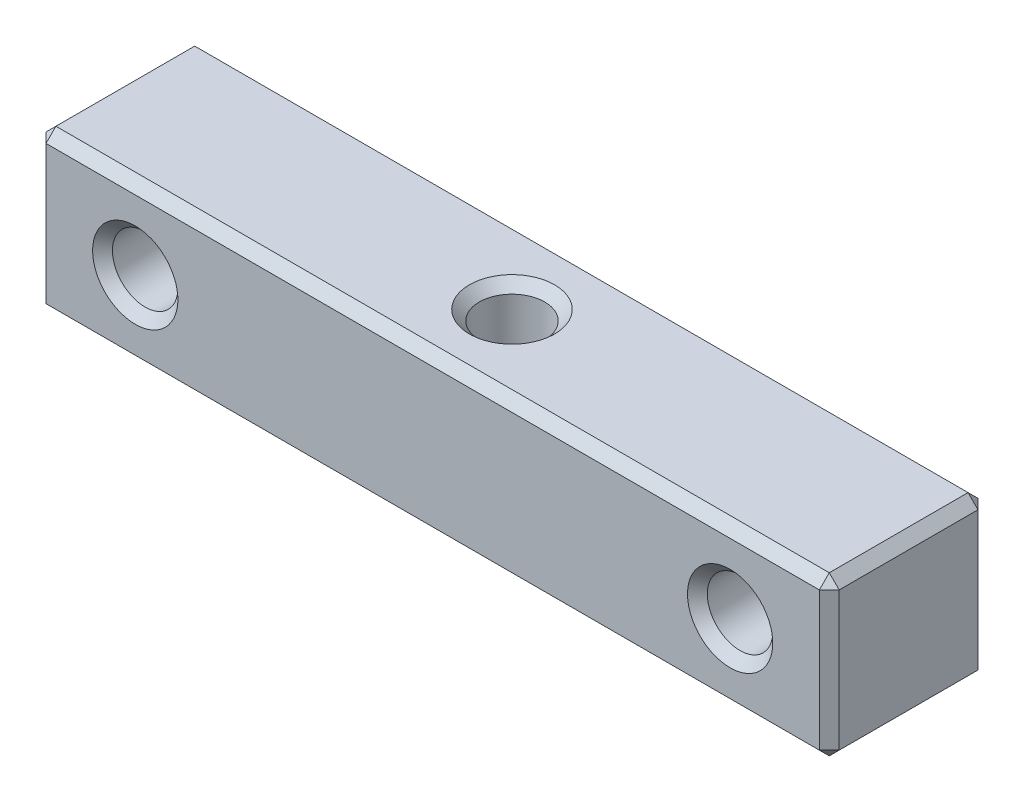
ISO-10303-21;
HEADER;
FILE_DESCRIPTION(('STEP AP214'),'2;1');
FILE_NAME('part.step','',(''),(''),'','','');
FILE_SCHEMA(('AUTOMOTIVE_DESIGN { 1 0 10303 214 1 1 1 1 }'));
ENDSEC;
DATA;
#1=APPLICATION_CONTEXT('core data for automotive mechanical design processes');
#2=APPLICATION_PROTOCOL_DEFINITION('international standard','automotive_design',2000,#1);
#3=PRODUCT_CONTEXT('',#1,'mechanical');
#4=PRODUCT('Part','Part','',(#3));
#5=PRODUCT_RELATED_PRODUCT_CATEGORY('part','',(#4));
#6=PRODUCT_DEFINITION_FORMATION('','',#4);
#7=PRODUCT_DEFINITION_CONTEXT('part definition',#1,'design');
#8=PRODUCT_DEFINITION('design','',#6,#7);
#9=PRODUCT_DEFINITION_SHAPE('','',#8);
#10=(LENGTH_UNIT() NAMED_UNIT(*) SI_UNIT(.MILLI.,.METRE.));
#11=(NAMED_UNIT(*) PLANE_ANGLE_UNIT() SI_UNIT($,.RADIAN.));
#12=(NAMED_UNIT(*) SI_UNIT($,.STERADIAN.) SOLID_ANGLE_UNIT());
#13=UNCERTAINTY_MEASURE_WITH_UNIT(LENGTH_MEASURE(1.E-05),#10,'distance_accuracy_value','');
#14=(GEOMETRIC_REPRESENTATION_CONTEXT(3) GLOBAL_UNCERTAINTY_ASSIGNED_CONTEXT((#13)) GLOBAL_UNIT_ASSIGNED_CONTEXT((#10,
#11,#12)) REPRESENTATION_CONTEXT('',''));
#15=CARTESIAN_POINT('',(0.,0.,0.));
#16=DIRECTION('',(0.,0.,1.));
#17=DIRECTION('',(1.,0.,0.));
#18=AXIS2_PLACEMENT_3D('',#15,#16,#17);
#19=CARTESIAN_POINT('',(20.,-4.,4.));
#20=DIRECTION('',(-1.,0.,0.));
#21=DIRECTION('',(0.,0.,1.));
#22=AXIS2_PLACEMENT_3D('',#19,#20,#21);
#23=PLANE('',#22);
#24=DIRECTION('',(0.,1.,0.));
#25=VECTOR('',#24,1.);
#26=CARTESIAN_POINT('',(20.,4.,-3.5));
#27=LINE('',#26,#25);
#28=CARTESIAN_POINT('',(20.,-3.50000000000001,-3.5));
#29=VERTEX_POINT('',#28);
#30=CARTESIAN_POINT('',(20.,3.5,-3.5));
#31=VERTEX_POINT('',#30);
#32=EDGE_CURVE('E205',#29,#31,#27,.T.);
#33=ORIENTED_EDGE('',*,*,#32,.T.);
#34=DIRECTION('',(0.,0.,1.));
#35=VECTOR('',#34,1.);
#36=CARTESIAN_POINT('',(20.,3.5,4.));
#37=LINE('',#36,#35);
#38=CARTESIAN_POINT('',(20.,3.5,3.5));
#39=VERTEX_POINT('',#38);
#40=EDGE_CURVE('E214',#31,#39,#37,.T.);
#41=ORIENTED_EDGE('',*,*,#40,.T.);
#42=DIRECTION('',(0.,-1.,0.));
#43=VECTOR('',#42,1.);
#44=CARTESIAN_POINT('',(20.,-4.,3.5));
#45=LINE('',#44,#43);
#46=CARTESIAN_POINT('',(20.,-3.50000000000001,3.5));
#47=VERTEX_POINT('',#46);
#48=EDGE_CURVE('E211',#39,#47,#45,.T.);
#49=ORIENTED_EDGE('',*,*,#48,.T.);
#50=DIRECTION('',(0.,0.,-1.));
#51=VECTOR('',#50,1.);
#52=CARTESIAN_POINT('',(20.,-3.50000000000001,4.));
#53=LINE('',#52,#51);
#54=EDGE_CURVE('E208',#47,#29,#53,.T.);
#55=ORIENTED_EDGE('',*,*,#54,.T.);
#56=EDGE_LOOP('',(#33,#41,#49,#55));
#57=FACE_BOUND('',#56,.T.);
#58=ADVANCED_FACE('F42',(#57),#23,.F.);
#59=CARTESIAN_POINT('',(-20.,4.,4.));
#60=DIRECTION('',(0.,-1.,0.));
#61=DIRECTION('',(0.,0.,-1.));
#62=AXIS2_PLACEMENT_3D('',#59,#60,#61);
#63=PLANE('',#62);
#64=DIRECTION('',(0.,0.,1.));
#65=VECTOR('',#64,1.);
#66=CARTESIAN_POINT('',(-19.5,4.,4.));
#67=LINE('',#66,#65);
#68=CARTESIAN_POINT('',(-19.5,4.,-3.5));
#69=VERTEX_POINT('',#68);
#70=CARTESIAN_POINT('',(-19.5,4.,3.5));
#71=VERTEX_POINT('',#70);
#72=EDGE_CURVE('E195',#69,#71,#67,.T.);
#73=ORIENTED_EDGE('',*,*,#72,.T.);
#74=DIRECTION('',(1.,0.,0.));
#75=VECTOR('',#74,1.);
#76=CARTESIAN_POINT('',(-20.,4.,3.5));
#77=LINE('',#76,#75);
#78=CARTESIAN_POINT('',(19.5,4.,3.5));
#79=VERTEX_POINT('',#78);
#80=EDGE_CURVE('E201',#71,#79,#77,.T.);
#81=ORIENTED_EDGE('',*,*,#80,.T.);
#82=DIRECTION('',(0.,0.,-1.));
#83=VECTOR('',#82,1.);
#84=CARTESIAN_POINT('',(19.5,4.,4.));
#85=LINE('',#84,#83);
#86=CARTESIAN_POINT('',(19.5,4.,-3.5));
#87=VERTEX_POINT('',#86);
#88=EDGE_CURVE('E198',#79,#87,#85,.T.);
#89=ORIENTED_EDGE('',*,*,#88,.T.);
#90=DIRECTION('',(-1.,0.,0.));
#91=VECTOR('',#90,1.);
#92=CARTESIAN_POINT('',(-20.,4.,-3.5));
#93=LINE('',#92,#91);
#94=EDGE_CURVE('E192',#87,#69,#93,.T.);
#95=ORIENTED_EDGE('',*,*,#94,.T.);
#96=EDGE_LOOP('',(#73,#81,#89,#95));
#97=FACE_BOUND('',#96,.T.);
#98=CARTESIAN_POINT('',(0.,4.,0.));
#99=DIRECTION('',(0.,-1.,0.));
#100=DIRECTION('',(0.,0.,-1.));
#101=AXIS2_PLACEMENT_3D('',#98,#99,#100);
#102=CIRCLE('',#101,2.14999999999999);
#103=CARTESIAN_POINT('',(0.,4.,-2.14999999999999));
#104=VERTEX_POINT('',#103);
#105=EDGE_CURVE('E188',#104,#104,#102,.T.);
#106=ORIENTED_EDGE('',*,*,#105,.T.);
#107=EDGE_LOOP('',(#106));
#108=FACE_BOUND('',#107,.T.);
#109=ADVANCED_FACE('F394',(#97,#108),#63,.F.);
#110=CARTESIAN_POINT('',(-20.,-4.,4.));
#111=DIRECTION('',(1.,0.,0.));
#112=DIRECTION('',(0.,0.,-1.));
#113=AXIS2_PLACEMENT_3D('',#110,#111,#112);
#114=PLANE('',#113);
#115=DIRECTION('',(0.,0.,1.));
#116=VECTOR('',#115,1.);
#117=CARTESIAN_POINT('',(-20.,-3.5,4.));
#118=LINE('',#117,#116);
#119=CARTESIAN_POINT('',(-20.,-3.5,-3.5));
#120=VERTEX_POINT('',#119);
#121=CARTESIAN_POINT('',(-20.,-3.5,3.5));
#122=VERTEX_POINT('',#121);
#123=EDGE_CURVE('E221',#120,#122,#118,.T.);
#124=ORIENTED_EDGE('',*,*,#123,.T.);
#125=DIRECTION('',(0.,1.,0.));
#126=VECTOR('',#125,1.);
#127=CARTESIAN_POINT('',(-20.,-4.,3.5));
#128=LINE('',#127,#126);
#129=CARTESIAN_POINT('',(-20.,3.5,3.5));
#130=VERTEX_POINT('',#129);
#131=EDGE_CURVE('E228',#122,#130,#128,.T.);
#132=ORIENTED_EDGE('',*,*,#131,.T.);
#133=DIRECTION('',(0.,0.,-1.));
#134=VECTOR('',#133,1.);
#135=CARTESIAN_POINT('',(-20.,3.5,4.));
#136=LINE('',#135,#134);
#137=CARTESIAN_POINT('',(-20.,3.5,-3.5));
#138=VERTEX_POINT('',#137);
#139=EDGE_CURVE('E224',#130,#138,#136,.T.);
#140=ORIENTED_EDGE('',*,*,#139,.T.);
#141=DIRECTION('',(0.,-1.,0.));
#142=VECTOR('',#141,1.);
#143=CARTESIAN_POINT('',(-20.,-4.,-3.5));
#144=LINE('',#143,#142);
#145=EDGE_CURVE('E218',#138,#120,#144,.T.);
#146=ORIENTED_EDGE('',*,*,#145,.T.);
#147=EDGE_LOOP('',(#124,#132,#140,#146));
#148=FACE_BOUND('',#147,.T.);
#149=ADVANCED_FACE('F400',(#148),#114,.F.);
#150=CARTESIAN_POINT('',(-20.,-4.,4.));
#151=DIRECTION('',(0.,1.,0.));
#152=DIRECTION('',(0.,0.,1.));
#153=AXIS2_PLACEMENT_3D('',#150,#151,#152);
#154=PLANE('',#153);
#155=DIRECTION('',(-1.,0.,0.));
#156=VECTOR('',#155,1.);
#157=CARTESIAN_POINT('',(-20.,-4.,3.5));
#158=LINE('',#157,#156);
#159=CARTESIAN_POINT('',(19.5,-4.,3.5));
#160=VERTEX_POINT('',#159);
#161=CARTESIAN_POINT('',(-19.5,-4.,3.5));
#162=VERTEX_POINT('',#161);
#163=EDGE_CURVE('E154',#160,#162,#158,.T.);
#164=ORIENTED_EDGE('',*,*,#163,.T.);
#165=DIRECTION('',(0.,0.,-1.));
#166=VECTOR('',#165,1.);
#167=CARTESIAN_POINT('',(-19.5,-4.,4.));
#168=LINE('',#167,#166);
#169=CARTESIAN_POINT('',(-19.5,-4.,-3.5));
#170=VERTEX_POINT('',#169);
#171=EDGE_CURVE('E243',#162,#170,#168,.T.);
#172=ORIENTED_EDGE('',*,*,#171,.T.);
#173=DIRECTION('',(1.,0.,0.));
#174=VECTOR('',#173,1.);
#175=CARTESIAN_POINT('',(20.,-4.,-3.5));
#176=LINE('',#175,#174);
#177=CARTESIAN_POINT('',(19.5,-4.,-3.5));
#178=VERTEX_POINT('',#177);
#179=EDGE_CURVE('E235',#170,#178,#176,.T.);
#180=ORIENTED_EDGE('',*,*,#179,.T.);
#181=DIRECTION('',(0.,0.,1.));
#182=VECTOR('',#181,1.);
#183=CARTESIAN_POINT('',(19.5,-4.,4.));
#184=LINE('',#183,#182);
#185=EDGE_CURVE('E238',#178,#160,#184,.T.);
#186=ORIENTED_EDGE('',*,*,#185,.T.);
#187=EDGE_LOOP('',(#164,#172,#180,#186));
#188=FACE_BOUND('',#187,.T.);
#189=CARTESIAN_POINT('',(0.,-4.,0.));
#190=DIRECTION('',(0.,1.,0.));
#191=DIRECTION('',(0.,0.,1.));
#192=AXIS2_PLACEMENT_3D('',#189,#190,#191);
#193=CIRCLE('',#192,2.14999999999999);
#194=CARTESIAN_POINT('',(0.,-4.,2.14999999999999));
#195=VERTEX_POINT('',#194);
#196=EDGE_CURVE('E231',#195,#195,#193,.T.);
#197=ORIENTED_EDGE('',*,*,#196,.T.);
#198=EDGE_LOOP('',(#197));
#199=FACE_BOUND('',#198,.T.);
#200=ADVANCED_FACE('F570',(#188,#199),#154,.F.);
#201=CARTESIAN_POINT('',(0.,0.,4.));
#202=DIRECTION('',(0.,0.,-1.));
#203=DIRECTION('',(-1.,0.,0.));
#204=AXIS2_PLACEMENT_3D('',#201,#202,#203);
#205=PLANE('',#204);
#206=DIRECTION('',(0.,1.,0.));
#207=VECTOR('',#206,1.);
#208=CARTESIAN_POINT('',(19.5,0.,4.));
#209=LINE('',#208,#207);
#210=CARTESIAN_POINT('',(19.5,-3.50000000000001,4.));
#211=VERTEX_POINT('',#210);
#212=CARTESIAN_POINT('',(19.5,3.5,4.));
#213=VERTEX_POINT('',#212);
#214=EDGE_CURVE('E140',#211,#213,#209,.T.);
#215=ORIENTED_EDGE('',*,*,#214,.T.);
#216=DIRECTION('',(-1.,0.,0.));
#217=VECTOR('',#216,1.);
#218=CARTESIAN_POINT('',(0.,3.5,4.));
#219=LINE('',#218,#217);
#220=CARTESIAN_POINT('',(-19.5,3.5,4.));
#221=VERTEX_POINT('',#220);
#222=EDGE_CURVE('E185',#213,#221,#219,.T.);
#223=ORIENTED_EDGE('',*,*,#222,.T.);
#224=DIRECTION('',(0.,-1.,0.));
#225=VECTOR('',#224,1.);
#226=CARTESIAN_POINT('',(-19.5,0.,4.));
#227=LINE('',#226,#225);
#228=CARTESIAN_POINT('',(-19.5,-3.50000000000001,4.));
#229=VERTEX_POINT('',#228);
#230=EDGE_CURVE('E143',#221,#229,#227,.T.);
#231=ORIENTED_EDGE('',*,*,#230,.T.);
#232=DIRECTION('',(1.,0.,0.));
#233=VECTOR('',#232,1.);
#234=CARTESIAN_POINT('',(0.,-3.50000000000001,4.));
#235=LINE('',#234,#233);
#236=EDGE_CURVE('E134',#229,#211,#235,.T.);
#237=ORIENTED_EDGE('',*,*,#236,.T.);
#238=EDGE_LOOP('',(#215,#223,#231,#237));
#239=FACE_BOUND('',#238,.T.);
#240=CARTESIAN_POINT('',(15.,0.,4.));
#241=DIRECTION('',(0.,0.,-1.));
#242=DIRECTION('',(-1.,0.,0.));
#243=AXIS2_PLACEMENT_3D('',#240,#241,#242);
#244=CIRCLE('',#243,2.15000000000001);
#245=CARTESIAN_POINT('',(12.85,0.,4.));
#246=VERTEX_POINT('',#245);
#247=EDGE_CURVE('E175',#246,#246,#244,.T.);
#248=ORIENTED_EDGE('',*,*,#247,.T.);
#249=EDGE_LOOP('',(#248));
#250=FACE_BOUND('',#249,.T.);
#251=CARTESIAN_POINT('',(-15.,0.,4.));
#252=DIRECTION('',(0.,0.,-1.));
#253=DIRECTION('',(-1.,0.,0.));
#254=AXIS2_PLACEMENT_3D('',#251,#252,#253);
#255=CIRCLE('',#254,2.15000000000001);
#256=CARTESIAN_POINT('',(-17.15,0.,4.));
#257=VERTEX_POINT('',#256);
#258=EDGE_CURVE('E179',#257,#257,#255,.T.);
#259=ORIENTED_EDGE('',*,*,#258,.T.);
#260=EDGE_LOOP('',(#259));
#261=FACE_BOUND('',#260,.T.);
#262=ADVANCED_FACE('F136',(#239,#250,#261),#205,.F.);
#263=CARTESIAN_POINT('',(0.,0.,-4.));
#264=DIRECTION('',(0.,0.,-1.));
#265=DIRECTION('',(-1.,0.,0.));
#266=AXIS2_PLACEMENT_3D('',#263,#264,#265);
#267=PLANE('',#266);
#268=DIRECTION('',(0.,-1.,0.));
#269=VECTOR('',#268,1.);
#270=CARTESIAN_POINT('',(19.5,-4.,-4.));
#271=LINE('',#270,#269);
#272=CARTESIAN_POINT('',(19.5,3.5,-4.));
#273=VERTEX_POINT('',#272);
#274=CARTESIAN_POINT('',(19.5,-3.5,-4.));
#275=VERTEX_POINT('',#274);
#276=EDGE_CURVE('E255',#273,#275,#271,.T.);
#277=ORIENTED_EDGE('',*,*,#276,.T.);
#278=DIRECTION('',(-1.,0.,0.));
#279=VECTOR('',#278,1.);
#280=CARTESIAN_POINT('',(-20.,-3.5,-4.));
#281=LINE('',#280,#279);
#282=CARTESIAN_POINT('',(-19.5,-3.5,-4.));
#283=VERTEX_POINT('',#282);
#284=EDGE_CURVE('E263',#275,#283,#281,.T.);
#285=ORIENTED_EDGE('',*,*,#284,.T.);
#286=DIRECTION('',(0.,1.,0.));
#287=VECTOR('',#286,1.);
#288=CARTESIAN_POINT('',(-19.5,4.,-4.));
#289=LINE('',#288,#287);
#290=CARTESIAN_POINT('',(-19.5,3.5,-4.));
#291=VERTEX_POINT('',#290);
#292=EDGE_CURVE('E61',#283,#291,#289,.T.);
#293=ORIENTED_EDGE('',*,*,#292,.T.);
#294=DIRECTION('',(1.,0.,0.));
#295=VECTOR('',#294,1.);
#296=CARTESIAN_POINT('',(20.,3.5,-4.));
#297=LINE('',#296,#295);
#298=EDGE_CURVE('E258',#291,#273,#297,.T.);
#299=ORIENTED_EDGE('',*,*,#298,.T.);
#300=EDGE_LOOP('',(#277,#285,#293,#299));
#301=FACE_BOUND('',#300,.T.);
#302=CARTESIAN_POINT('',(15.,0.,-4.));
#303=DIRECTION('',(0.,0.,-1.));
#304=DIRECTION('',(-1.,0.,0.));
#305=AXIS2_PLACEMENT_3D('',#302,#303,#304);
#306=CIRCLE('',#305,2.15000000000001);
#307=CARTESIAN_POINT('',(12.85,0.,-4.));
#308=VERTEX_POINT('',#307);
#309=EDGE_CURVE('E251',#308,#308,#306,.F.);
#310=ORIENTED_EDGE('',*,*,#309,.T.);
#311=EDGE_LOOP('',(#310));
#312=FACE_BOUND('',#311,.T.);
#313=CARTESIAN_POINT('',(-15.,0.,-4.));
#314=DIRECTION('',(0.,0.,-1.));
#315=DIRECTION('',(-1.,0.,0.));
#316=AXIS2_PLACEMENT_3D('',#313,#314,#315);
#317=CIRCLE('',#316,2.15000000000001);
#318=CARTESIAN_POINT('',(-17.15,0.,-4.));
#319=VERTEX_POINT('',#318);
#320=EDGE_CURVE('E247',#319,#319,#317,.F.);
#321=ORIENTED_EDGE('',*,*,#320,.T.);
#322=EDGE_LOOP('',(#321));
#323=FACE_BOUND('',#322,.T.);
#324=ADVANCED_FACE('F390',(#301,#312,#323),#267,.T.);
#325=CARTESIAN_POINT('',(15.,0.,4.));
#326=DIRECTION('',(0.,0.,1.));
#327=DIRECTION('',(1.,0.,0.));
#328=AXIS2_PLACEMENT_3D('',#325,#326,#327);
#329=CYLINDRICAL_SURFACE('',#328,1.65);
#330=CARTESIAN_POINT('',(15.,0.,-3.5));
#331=DIRECTION('',(0.,0.,-1.));
#332=DIRECTION('',(-1.,0.,0.));
#333=AXIS2_PLACEMENT_3D('',#330,#331,#332);
#334=CIRCLE('',#333,1.65);
#335=CARTESIAN_POINT('',(13.35,0.,-3.5));
#336=VERTEX_POINT('',#335);
#337=EDGE_CURVE('E270',#336,#336,#334,.T.);
#338=ORIENTED_EDGE('',*,*,#337,.T.);
#339=EDGE_LOOP('',(#338));
#340=FACE_BOUND('',#339,.T.);
#341=CARTESIAN_POINT('',(15.,0.,3.5));
#342=DIRECTION('',(0.,0.,-1.));
#343=DIRECTION('',(-1.,0.,0.));
#344=AXIS2_PLACEMENT_3D('',#341,#342,#343);
#345=CIRCLE('',#344,1.65);
#346=CARTESIAN_POINT('',(13.35,0.,3.5));
#347=VERTEX_POINT('',#346);
#348=EDGE_CURVE('E266',#347,#347,#345,.F.);
#349=ORIENTED_EDGE('',*,*,#348,.T.);
#350=EDGE_LOOP('',(#349));
#351=FACE_BOUND('',#350,.T.);
#352=ADVANCED_FACE('F380',(#340,#351),#329,.F.);
#353=CARTESIAN_POINT('',(-15.,0.,4.));
#354=DIRECTION('',(0.,0.,1.));
#355=DIRECTION('',(1.,0.,0.));
#356=AXIS2_PLACEMENT_3D('',#353,#354,#355);
#357=CYLINDRICAL_SURFACE('',#356,1.65);
#358=CARTESIAN_POINT('',(-15.,0.,-3.5));
#359=DIRECTION('',(0.,0.,-1.));
#360=DIRECTION('',(-1.,0.,0.));
#361=AXIS2_PLACEMENT_3D('',#358,#359,#360);
#362=CIRCLE('',#361,1.65);
#363=CARTESIAN_POINT('',(-16.65,0.,-3.5));
#364=VERTEX_POINT('',#363);
#365=EDGE_CURVE('E278',#364,#364,#362,.T.);
#366=ORIENTED_EDGE('',*,*,#365,.T.);
#367=EDGE_LOOP('',(#366));
#368=FACE_BOUND('',#367,.T.);
#369=CARTESIAN_POINT('',(-15.,0.,3.5));
#370=DIRECTION('',(0.,0.,-1.));
#371=DIRECTION('',(-1.,0.,0.));
#372=AXIS2_PLACEMENT_3D('',#369,#370,#371);
#373=CIRCLE('',#372,1.65);
#374=CARTESIAN_POINT('',(-16.65,0.,3.5));
#375=VERTEX_POINT('',#374);
#376=EDGE_CURVE('E274',#375,#375,#373,.F.);
#377=ORIENTED_EDGE('',*,*,#376,.T.);
#378=EDGE_LOOP('',(#377));
#379=FACE_BOUND('',#378,.T.);
#380=ADVANCED_FACE('F377',(#368,#379),#357,.F.);
#381=CARTESIAN_POINT('',(0.,4.,0.));
#382=DIRECTION('',(0.,1.,0.));
#383=DIRECTION('',(0.,0.,1.));
#384=AXIS2_PLACEMENT_3D('',#381,#382,#383);
#385=CYLINDRICAL_SURFACE('',#384,1.64999999999999);
#386=CARTESIAN_POINT('',(0.,-3.5,0.));
#387=DIRECTION('',(0.,1.,0.));
#388=DIRECTION('',(0.,0.,1.));
#389=AXIS2_PLACEMENT_3D('',#386,#387,#388);
#390=CIRCLE('',#389,1.64999999999999);
#391=CARTESIAN_POINT('',(0.,-3.5,1.64999999999999));
#392=VERTEX_POINT('',#391);
#393=EDGE_CURVE('E11',#392,#392,#390,.F.);
#394=ORIENTED_EDGE('',*,*,#393,.T.);
#395=EDGE_LOOP('',(#394));
#396=FACE_BOUND('',#395,.T.);
#397=CARTESIAN_POINT('',(0.,3.5,0.));
#398=DIRECTION('',(0.,-1.,0.));
#399=DIRECTION('',(0.,0.,-1.));
#400=AXIS2_PLACEMENT_3D('',#397,#398,#399);
#401=CIRCLE('',#400,1.64999999999999);
#402=CARTESIAN_POINT('',(0.,3.5,-1.64999999999999));
#403=VERTEX_POINT('',#402);
#404=EDGE_CURVE('E53',#403,#403,#401,.F.);
#405=ORIENTED_EDGE('',*,*,#404,.T.);
#406=EDGE_LOOP('',(#405));
#407=FACE_BOUND('',#406,.T.);
#408=ADVANCED_FACE('F379',(#396,#407),#385,.F.);
#409=CARTESIAN_POINT('',(-20.,-4.,-3.5));
#410=DIRECTION('',(0.,-0.707106781186545,-0.70710678118655));
#411=DIRECTION('',(-1.,0.,0.));
#412=AXIS2_PLACEMENT_3D('',#409,#410,#411);
#413=PLANE('',#412);
#414=DIRECTION('',(0.,0.70710678118655,-0.707106781186545));
#415=VECTOR('',#414,1.);
#416=CARTESIAN_POINT('',(19.5,-3.75,-3.75));
#417=LINE('',#416,#415);
#418=EDGE_CURVE('E47',#178,#275,#417,.T.);
#419=ORIENTED_EDGE('',*,*,#418,.F.);
#420=ORIENTED_EDGE('',*,*,#179,.F.);
#421=DIRECTION('',(0.,-0.70710678118655,0.707106781186545));
#422=VECTOR('',#421,1.);
#423=CARTESIAN_POINT('',(-19.5,-4.,-3.5));
#424=LINE('',#423,#422);
#425=EDGE_CURVE('E351',#283,#170,#424,.T.);
#426=ORIENTED_EDGE('',*,*,#425,.F.);
#427=ORIENTED_EDGE('',*,*,#284,.F.);
#428=EDGE_LOOP('',(#419,#420,#426,#427));
#429=FACE_BOUND('',#428,.T.);
#430=ADVANCED_FACE('F387',(#429),#413,.T.);
#431=CARTESIAN_POINT('',(20.,-3.50000000000001,-3.5));
#432=DIRECTION('',(0.57735026918962,-0.577350269189628,-0.577350269189628));
#433=DIRECTION('',(0.,0.707106781186548,-0.707106781186548));
#434=AXIS2_PLACEMENT_3D('',#431,#432,#433);
#435=PLANE('',#434);
#436=DIRECTION('',(0.707106781186552,0.707106781186543,0.));
#437=VECTOR('',#436,1.);
#438=CARTESIAN_POINT('',(20.,-3.50000000000001,-3.5));
#439=LINE('',#438,#437);
#440=EDGE_CURVE('E344',#178,#29,#439,.T.);
#441=ORIENTED_EDGE('',*,*,#440,.F.);
#442=ORIENTED_EDGE('',*,*,#418,.T.);
#443=DIRECTION('',(0.70710678118655,0.,0.707106781186545));
#444=VECTOR('',#443,1.);
#445=CARTESIAN_POINT('',(20.,-3.50000000000001,-3.5));
#446=LINE('',#445,#444);
#447=EDGE_CURVE('E348',#29,#275,#446,.F.);
#448=ORIENTED_EDGE('',*,*,#447,.F.);
#449=EDGE_LOOP('',(#441,#442,#448));
#450=FACE_BOUND('',#449,.T.);
#451=ADVANCED_FACE('F526',(#450),#435,.T.);
#452=CARTESIAN_POINT('',(-19.5,-4.,-3.5));
#453=DIRECTION('',(-0.577350269189626,-0.577350269189622,-0.57735026918963));
#454=DIRECTION('',(-0.70710678118655,0.,0.707106781186545));
#455=AXIS2_PLACEMENT_3D('',#452,#453,#454);
#456=PLANE('',#455);
#457=DIRECTION('',(0.70710678118655,0.,-0.707106781186545));
#458=VECTOR('',#457,1.);
#459=CARTESIAN_POINT('',(-19.75,-3.5,-3.75));
#460=LINE('',#459,#458);
#461=EDGE_CURVE('E338',#283,#120,#460,.F.);
#462=ORIENTED_EDGE('',*,*,#461,.F.);
#463=ORIENTED_EDGE('',*,*,#425,.T.);
#464=DIRECTION('',(0.707106781186545,-0.70710678118655,0.));
#465=VECTOR('',#464,1.);
#466=CARTESIAN_POINT('',(-19.5,-4.,-3.5));
#467=LINE('',#466,#465);
#468=EDGE_CURVE('E341',#120,#170,#467,.T.);
#469=ORIENTED_EDGE('',*,*,#468,.F.);
#470=EDGE_LOOP('',(#462,#463,#469));
#471=FACE_BOUND('',#470,.T.);
#472=ADVANCED_FACE('F519',(#471),#456,.T.);
#473=CARTESIAN_POINT('',(20.,-4.,-3.5));
#474=DIRECTION('',(0.707106781186545,0.,-0.70710678118655));
#475=DIRECTION('',(0.,-1.,0.));
#476=AXIS2_PLACEMENT_3D('',#473,#474,#475);
#477=PLANE('',#476);
#478=ORIENTED_EDGE('',*,*,#447,.T.);
#479=ORIENTED_EDGE('',*,*,#276,.F.);
#480=DIRECTION('',(-0.70710678118655,0.,-0.707106781186545));
#481=VECTOR('',#480,1.);
#482=CARTESIAN_POINT('',(19.75,3.5,-3.75));
#483=LINE('',#482,#481);
#484=EDGE_CURVE('E330',#31,#273,#483,.T.);
#485=ORIENTED_EDGE('',*,*,#484,.F.);
#486=ORIENTED_EDGE('',*,*,#32,.F.);
#487=EDGE_LOOP('',(#478,#479,#485,#486));
#488=FACE_BOUND('',#487,.T.);
#489=ADVANCED_FACE('F512',(#488),#477,.T.);
#490=CARTESIAN_POINT('',(20.,-3.50000000000001,4.));
#491=DIRECTION('',(-0.707106781186543,0.707106781186552,0.));
#492=DIRECTION('',(0.,0.,-1.));
#493=AXIS2_PLACEMENT_3D('',#490,#491,#492);
#494=PLANE('',#493);
#495=ORIENTED_EDGE('',*,*,#440,.T.);
#496=ORIENTED_EDGE('',*,*,#54,.F.);
#497=DIRECTION('',(-0.707106781186552,-0.707106781186543,0.));
#498=VECTOR('',#497,1.);
#499=CARTESIAN_POINT('',(19.75,-3.75,3.5));
#500=LINE('',#499,#498);
#501=EDGE_CURVE('E159',#160,#47,#500,.F.);
#502=ORIENTED_EDGE('',*,*,#501,.F.);
#503=ORIENTED_EDGE('',*,*,#185,.F.);
#504=EDGE_LOOP('',(#495,#496,#502,#503));
#505=FACE_BOUND('',#504,.T.);
#506=ADVANCED_FACE('F506',(#505),#494,.F.);
#507=CARTESIAN_POINT('',(0.,-3.50000000000001,4.));
#508=DIRECTION('',(0.,0.70710678118655,-0.707106781186545));
#509=DIRECTION('',(1.,0.,0.));
#510=AXIS2_PLACEMENT_3D('',#507,#508,#509);
#511=PLANE('',#510);
#512=DIRECTION('',(0.,-0.707106781186545,-0.70710678118655));
#513=VECTOR('',#512,1.);
#514=CARTESIAN_POINT('',(-19.5,-3.75,3.75));
#515=LINE('',#514,#513);
#516=EDGE_CURVE('E160',#162,#229,#515,.F.);
#517=ORIENTED_EDGE('',*,*,#516,.F.);
#518=ORIENTED_EDGE('',*,*,#163,.F.);
#519=DIRECTION('',(0.,0.707106781186545,0.70710678118655));
#520=VECTOR('',#519,1.);
#521=CARTESIAN_POINT('',(19.5,-3.50000000000001,4.));
#522=LINE('',#521,#520);
#523=EDGE_CURVE('E151',#211,#160,#522,.F.);
#524=ORIENTED_EDGE('',*,*,#523,.F.);
#525=ORIENTED_EDGE('',*,*,#236,.F.);
#526=EDGE_LOOP('',(#517,#518,#524,#525));
#527=FACE_BOUND('',#526,.T.);
#528=ADVANCED_FACE('F153',(#527),#511,.F.);
#529=CARTESIAN_POINT('',(-19.5,-4.,4.));
#530=DIRECTION('',(0.70710678118655,0.707106781186545,0.));
#531=DIRECTION('',(0.,0.,-1.));
#532=AXIS2_PLACEMENT_3D('',#529,#530,#531);
#533=PLANE('',#532);
#534=ORIENTED_EDGE('',*,*,#468,.T.);
#535=ORIENTED_EDGE('',*,*,#171,.F.);
#536=DIRECTION('',(-0.707106781186545,0.70710678118655,0.));
#537=VECTOR('',#536,1.);
#538=CARTESIAN_POINT('',(-20.,-3.5,3.5));
#539=LINE('',#538,#537);
#540=EDGE_CURVE('E322',#122,#162,#539,.F.);
#541=ORIENTED_EDGE('',*,*,#540,.F.);
#542=ORIENTED_EDGE('',*,*,#123,.F.);
#543=EDGE_LOOP('',(#534,#535,#541,#542));
#544=FACE_BOUND('',#543,.T.);
#545=ADVANCED_FACE('F494',(#544),#533,.F.);
#546=CARTESIAN_POINT('',(-20.,-4.,-3.5));
#547=DIRECTION('',(-0.707106781186545,0.,-0.70710678118655));
#548=DIRECTION('',(0.,1.,0.));
#549=AXIS2_PLACEMENT_3D('',#546,#547,#548);
#550=PLANE('',#549);
#551=ORIENTED_EDGE('',*,*,#461,.T.);
#552=ORIENTED_EDGE('',*,*,#145,.F.);
#553=DIRECTION('',(-0.70710678118655,0.,0.707106781186545));
#554=VECTOR('',#553,1.);
#555=CARTESIAN_POINT('',(-20.,3.5,-3.5));
#556=LINE('',#555,#554);
#557=EDGE_CURVE('E318',#291,#138,#556,.T.);
#558=ORIENTED_EDGE('',*,*,#557,.F.);
#559=ORIENTED_EDGE('',*,*,#292,.F.);
#560=EDGE_LOOP('',(#551,#552,#558,#559));
#561=FACE_BOUND('',#560,.T.);
#562=ADVANCED_FACE('F487',(#561),#550,.T.);
#563=CARTESIAN_POINT('',(-20.,4.,-3.5));
#564=DIRECTION('',(0.,0.707106781186545,-0.70710678118655));
#565=DIRECTION('',(1.,0.,0.));
#566=AXIS2_PLACEMENT_3D('',#563,#564,#565);
#567=PLANE('',#566);
#568=DIRECTION('',(0.,0.70710678118655,0.707106781186545));
#569=VECTOR('',#568,1.);
#570=CARTESIAN_POINT('',(19.5,4.,-3.5));
#571=LINE('',#570,#569);
#572=EDGE_CURVE('E334',#273,#87,#571,.T.);
#573=ORIENTED_EDGE('',*,*,#572,.F.);
#574=ORIENTED_EDGE('',*,*,#298,.F.);
#575=DIRECTION('',(0.,-0.70710678118655,-0.707106781186545));
#576=VECTOR('',#575,1.);
#577=CARTESIAN_POINT('',(-19.5,3.75,-3.75));
#578=LINE('',#577,#576);
#579=EDGE_CURVE('E314',#69,#291,#578,.T.);
#580=ORIENTED_EDGE('',*,*,#579,.F.);
#581=ORIENTED_EDGE('',*,*,#94,.F.);
#582=EDGE_LOOP('',(#573,#574,#580,#581));
#583=FACE_BOUND('',#582,.T.);
#584=ADVANCED_FACE('F480',(#583),#567,.T.);
#585=CARTESIAN_POINT('',(19.5,4.,-3.5));
#586=DIRECTION('',(0.57735026918962,0.577350269189629,-0.577350269189628));
#587=DIRECTION('',(0.,0.707106781186547,0.707106781186548));
#588=AXIS2_PLACEMENT_3D('',#585,#586,#587);
#589=PLANE('',#588);
#590=ORIENTED_EDGE('',*,*,#484,.T.);
#591=ORIENTED_EDGE('',*,*,#572,.T.);
#592=DIRECTION('',(-0.707106781186552,0.707106781186543,0.));
#593=VECTOR('',#592,1.);
#594=CARTESIAN_POINT('',(19.5,4.,-3.5));
#595=LINE('',#594,#593);
#596=EDGE_CURVE('E168',#31,#87,#595,.T.);
#597=ORIENTED_EDGE('',*,*,#596,.F.);
#598=EDGE_LOOP('',(#590,#591,#597));
#599=FACE_BOUND('',#598,.T.);
#600=ADVANCED_FACE('F474',(#599),#589,.T.);
#601=CARTESIAN_POINT('',(19.5,-3.50000000000001,4.));
#602=DIRECTION('',(0.57735026918962,-0.577350269189633,0.577350269189624));
#603=DIRECTION('',(0.,-0.707106781186542,-0.707106781186552));
#604=AXIS2_PLACEMENT_3D('',#601,#602,#603);
#605=PLANE('',#604);
#606=ORIENTED_EDGE('',*,*,#523,.T.);
#607=ORIENTED_EDGE('',*,*,#501,.T.);
#608=DIRECTION('',(0.70710678118655,0.,-0.707106781186545));
#609=VECTOR('',#608,1.);
#610=CARTESIAN_POINT('',(19.5,-3.50000000000001,4.));
#611=LINE('',#610,#609);
#612=EDGE_CURVE('E163',#211,#47,#611,.T.);
#613=ORIENTED_EDGE('',*,*,#612,.F.);
#614=EDGE_LOOP('',(#606,#607,#613));
#615=FACE_BOUND('',#614,.T.);
#616=ADVANCED_FACE('F164',(#615),#605,.T.);
#617=CARTESIAN_POINT('',(-20.,-3.5,3.5));
#618=DIRECTION('',(-0.57735026918963,-0.577350269189626,0.577350269189622));
#619=DIRECTION('',(0.707106781186545,-0.70710678118655,0.));
#620=AXIS2_PLACEMENT_3D('',#617,#618,#619);
#621=PLANE('',#620);
#622=ORIENTED_EDGE('',*,*,#540,.T.);
#623=ORIENTED_EDGE('',*,*,#516,.T.);
#624=DIRECTION('',(0.707106781186545,0.,0.70710678118655));
#625=VECTOR('',#624,1.);
#626=CARTESIAN_POINT('',(-20.,-3.5,3.5));
#627=LINE('',#626,#625);
#628=EDGE_CURVE('E169',#122,#229,#627,.T.);
#629=ORIENTED_EDGE('',*,*,#628,.F.);
#630=EDGE_LOOP('',(#622,#623,#629));
#631=FACE_BOUND('',#630,.T.);
#632=ADVANCED_FACE('F461',(#631),#621,.T.);
#633=CARTESIAN_POINT('',(-20.,3.5,-3.5));
#634=DIRECTION('',(-0.577350269189622,0.577350269189626,-0.57735026918963));
#635=DIRECTION('',(0.,0.70710678118655,0.707106781186545));
#636=AXIS2_PLACEMENT_3D('',#633,#634,#635);
#637=PLANE('',#636);
#638=ORIENTED_EDGE('',*,*,#579,.T.);
#639=ORIENTED_EDGE('',*,*,#557,.T.);
#640=DIRECTION('',(-0.70710678118655,-0.707106781186545,0.));
#641=VECTOR('',#640,1.);
#642=CARTESIAN_POINT('',(-20.,3.5,-3.5));
#643=LINE('',#642,#641);
#644=EDGE_CURVE('E305',#69,#138,#643,.T.);
#645=ORIENTED_EDGE('',*,*,#644,.F.);
#646=EDGE_LOOP('',(#638,#639,#645));
#647=FACE_BOUND('',#646,.T.);
#648=ADVANCED_FACE('F454',(#647),#637,.T.);
#649=CARTESIAN_POINT('',(19.5,4.,4.));
#650=DIRECTION('',(-0.707106781186543,-0.707106781186552,0.));
#651=DIRECTION('',(0.,0.,-1.));
#652=AXIS2_PLACEMENT_3D('',#649,#650,#651);
#653=PLANE('',#652);
#654=ORIENTED_EDGE('',*,*,#596,.T.);
#655=ORIENTED_EDGE('',*,*,#88,.F.);
#656=DIRECTION('',(0.707106781186552,-0.707106781186543,0.));
#657=VECTOR('',#656,1.);
#658=CARTESIAN_POINT('',(19.5,4.,3.5));
#659=LINE('',#658,#657);
#660=EDGE_CURVE('E301',#39,#79,#659,.F.);
#661=ORIENTED_EDGE('',*,*,#660,.F.);
#662=ORIENTED_EDGE('',*,*,#40,.F.);
#663=EDGE_LOOP('',(#654,#655,#661,#662));
#664=FACE_BOUND('',#663,.T.);
#665=ADVANCED_FACE('F448',(#664),#653,.F.);
#666=CARTESIAN_POINT('',(19.5,0.,4.));
#667=DIRECTION('',(-0.707106781186545,0.,-0.70710678118655));
#668=DIRECTION('',(0.,1.,0.));
#669=AXIS2_PLACEMENT_3D('',#666,#667,#668);
#670=PLANE('',#669);
#671=ORIENTED_EDGE('',*,*,#612,.T.);
#672=ORIENTED_EDGE('',*,*,#48,.F.);
#673=DIRECTION('',(-0.70710678118655,0.,0.707106781186545));
#674=VECTOR('',#673,1.);
#675=CARTESIAN_POINT('',(19.75,3.5,3.75));
#676=LINE('',#675,#674);
#677=EDGE_CURVE('E172',#213,#39,#676,.F.);
#678=ORIENTED_EDGE('',*,*,#677,.F.);
#679=ORIENTED_EDGE('',*,*,#214,.F.);
#680=EDGE_LOOP('',(#671,#672,#678,#679));
#681=FACE_BOUND('',#680,.T.);
#682=ADVANCED_FACE('F171',(#681),#670,.F.);
#683=CARTESIAN_POINT('',(-19.5,0.,4.));
#684=DIRECTION('',(0.70710678118655,0.,-0.707106781186545));
#685=DIRECTION('',(0.,-1.,0.));
#686=AXIS2_PLACEMENT_3D('',#683,#684,#685);
#687=PLANE('',#686);
#688=ORIENTED_EDGE('',*,*,#628,.T.);
#689=ORIENTED_EDGE('',*,*,#230,.F.);
#690=DIRECTION('',(-0.707106781186545,0.,-0.70710678118655));
#691=VECTOR('',#690,1.);
#692=CARTESIAN_POINT('',(-19.5,3.5,4.));
#693=LINE('',#692,#691);
#694=EDGE_CURVE('E295',#130,#221,#693,.F.);
#695=ORIENTED_EDGE('',*,*,#694,.F.);
#696=ORIENTED_EDGE('',*,*,#131,.F.);
#697=EDGE_LOOP('',(#688,#689,#695,#696));
#698=FACE_BOUND('',#697,.T.);
#699=ADVANCED_FACE('F435',(#698),#687,.F.);
#700=CARTESIAN_POINT('',(-20.,3.5,4.));
#701=DIRECTION('',(0.707106781186545,-0.70710678118655,0.));
#702=DIRECTION('',(0.,0.,-1.));
#703=AXIS2_PLACEMENT_3D('',#700,#701,#702);
#704=PLANE('',#703);
#705=ORIENTED_EDGE('',*,*,#644,.T.);
#706=ORIENTED_EDGE('',*,*,#139,.F.);
#707=DIRECTION('',(0.70710678118655,0.707106781186545,0.));
#708=VECTOR('',#707,1.);
#709=CARTESIAN_POINT('',(-19.75,3.75,3.5));
#710=LINE('',#709,#708);
#711=EDGE_CURVE('E291',#71,#130,#710,.F.);
#712=ORIENTED_EDGE('',*,*,#711,.F.);
#713=ORIENTED_EDGE('',*,*,#72,.F.);
#714=EDGE_LOOP('',(#705,#706,#712,#713));
#715=FACE_BOUND('',#714,.T.);
#716=ADVANCED_FACE('F428',(#715),#704,.F.);
#717=CARTESIAN_POINT('',(19.5,4.,3.5));
#718=DIRECTION('',(0.57735026918962,0.577350269189632,0.577350269189625));
#719=DIRECTION('',(0.,-0.707106781186543,0.707106781186552));
#720=AXIS2_PLACEMENT_3D('',#717,#718,#719);
#721=PLANE('',#720);
#722=ORIENTED_EDGE('',*,*,#677,.T.);
#723=ORIENTED_EDGE('',*,*,#660,.T.);
#724=DIRECTION('',(0.,0.707106781186545,-0.70710678118655));
#725=VECTOR('',#724,1.);
#726=CARTESIAN_POINT('',(19.5,4.,3.5));
#727=LINE('',#726,#725);
#728=EDGE_CURVE('E288',#213,#79,#727,.T.);
#729=ORIENTED_EDGE('',*,*,#728,.F.);
#730=EDGE_LOOP('',(#722,#723,#729));
#731=FACE_BOUND('',#730,.T.);
#732=ADVANCED_FACE('F421',(#731),#721,.T.);
#733=CARTESIAN_POINT('',(-19.5,3.5,4.));
#734=DIRECTION('',(-0.577350269189626,0.57735026918963,0.577350269189622));
#735=DIRECTION('',(-0.70710678118655,-0.707106781186545,0.));
#736=AXIS2_PLACEMENT_3D('',#733,#734,#735);
#737=PLANE('',#736);
#738=ORIENTED_EDGE('',*,*,#711,.T.);
#739=ORIENTED_EDGE('',*,*,#694,.T.);
#740=DIRECTION('',(0.,-0.707106781186545,0.70710678118655));
#741=VECTOR('',#740,1.);
#742=CARTESIAN_POINT('',(-19.5,3.5,4.));
#743=LINE('',#742,#741);
#744=EDGE_CURVE('E285',#71,#221,#743,.T.);
#745=ORIENTED_EDGE('',*,*,#744,.F.);
#746=EDGE_LOOP('',(#738,#739,#745));
#747=FACE_BOUND('',#746,.T.);
#748=ADVANCED_FACE('F414',(#747),#737,.T.);
#749=CARTESIAN_POINT('',(0.,3.5,4.));
#750=DIRECTION('',(0.,-0.70710678118655,-0.707106781186545));
#751=DIRECTION('',(-1.,0.,0.));
#752=AXIS2_PLACEMENT_3D('',#749,#750,#751);
#753=PLANE('',#752);
#754=ORIENTED_EDGE('',*,*,#728,.T.);
#755=ORIENTED_EDGE('',*,*,#80,.F.);
#756=ORIENTED_EDGE('',*,*,#744,.T.);
#757=ORIENTED_EDGE('',*,*,#222,.F.);
#758=EDGE_LOOP('',(#754,#755,#756,#757));
#759=FACE_BOUND('',#758,.T.);
#760=ADVANCED_FACE('F406',(#759),#753,.F.);
#761=CARTESIAN_POINT('',(15.,0.,-3.5));
#762=DIRECTION('',(0.,0.,-1.));
#763=DIRECTION('',(-1.,0.,0.));
#764=AXIS2_PLACEMENT_3D('',#761,#762,#763);
#765=CONICAL_SURFACE('',#764,1.65,0.785398163397453);
#766=ORIENTED_EDGE('',*,*,#309,.F.);
#767=EDGE_LOOP('',(#766));
#768=FACE_BOUND('',#767,.T.);
#769=ORIENTED_EDGE('',*,*,#337,.F.);
#770=EDGE_LOOP('',(#769));
#771=FACE_BOUND('',#770,.T.);
#772=ADVANCED_FACE('F413',(#768,#771),#765,.F.);
#773=CARTESIAN_POINT('',(15.,0.,3.5));
#774=DIRECTION('',(0.,0.,1.));
#775=DIRECTION('',(1.,0.,0.));
#776=AXIS2_PLACEMENT_3D('',#773,#774,#775);
#777=CONICAL_SURFACE('',#776,1.65,0.785398163397453);
#778=ORIENTED_EDGE('',*,*,#247,.F.);
#779=EDGE_LOOP('',(#778));
#780=FACE_BOUND('',#779,.T.);
#781=ORIENTED_EDGE('',*,*,#348,.F.);
#782=EDGE_LOOP('',(#781));
#783=FACE_BOUND('',#782,.T.);
#784=ADVANCED_FACE('F542',(#780,#783),#777,.F.);
#785=CARTESIAN_POINT('',(-15.,0.,-3.5));
#786=DIRECTION('',(0.,0.,-1.));
#787=DIRECTION('',(-1.,0.,0.));
#788=AXIS2_PLACEMENT_3D('',#785,#786,#787);
#789=CONICAL_SURFACE('',#788,1.65,0.785398163397453);
#790=ORIENTED_EDGE('',*,*,#320,.F.);
#791=EDGE_LOOP('',(#790));
#792=FACE_BOUND('',#791,.T.);
#793=ORIENTED_EDGE('',*,*,#365,.F.);
#794=EDGE_LOOP('',(#793));
#795=FACE_BOUND('',#794,.T.);
#796=ADVANCED_FACE('F373',(#792,#795),#789,.F.);
#797=CARTESIAN_POINT('',(-15.,0.,3.5));
#798=DIRECTION('',(0.,0.,1.));
#799=DIRECTION('',(1.,0.,0.));
#800=AXIS2_PLACEMENT_3D('',#797,#798,#799);
#801=CONICAL_SURFACE('',#800,1.65,0.785398163397453);
#802=ORIENTED_EDGE('',*,*,#258,.F.);
#803=EDGE_LOOP('',(#802));
#804=FACE_BOUND('',#803,.T.);
#805=ORIENTED_EDGE('',*,*,#376,.F.);
#806=EDGE_LOOP('',(#805));
#807=FACE_BOUND('',#806,.T.);
#808=ADVANCED_FACE('F369',(#804,#807),#801,.F.);
#809=CARTESIAN_POINT('',(0.,-4.,0.));
#810=DIRECTION('',(0.,-1.,0.));
#811=DIRECTION('',(0.,0.,-1.));
#812=AXIS2_PLACEMENT_3D('',#809,#810,#811);
#813=CONICAL_SURFACE('',#812,2.14999999999999,0.785398163397444);
#814=ORIENTED_EDGE('',*,*,#393,.F.);
#815=EDGE_LOOP('',(#814));
#816=FACE_BOUND('',#815,.T.);
#817=ORIENTED_EDGE('',*,*,#196,.F.);
#818=EDGE_LOOP('',(#817));
#819=FACE_BOUND('',#818,.T.);
#820=ADVANCED_FACE('F372',(#816,#819),#813,.F.);
#821=CARTESIAN_POINT('',(0.,3.5,0.));
#822=DIRECTION('',(0.,1.,0.));
#823=DIRECTION('',(0.,0.,1.));
#824=AXIS2_PLACEMENT_3D('',#821,#822,#823);
#825=CONICAL_SURFACE('',#824,1.64999999999999,0.785398163397453);
#826=ORIENTED_EDGE('',*,*,#105,.F.);
#827=EDGE_LOOP('',(#826));
#828=FACE_BOUND('',#827,.T.);
#829=ORIENTED_EDGE('',*,*,#404,.F.);
#830=EDGE_LOOP('',(#829));
#831=FACE_BOUND('',#830,.T.);
#832=ADVANCED_FACE('F45',(#828,#831),#825,.F.);
#833=CLOSED_SHELL('',(#58,#109,#149,#200,#262,#324,#352,#380,#408,#430,#451,#472,#489,#506,#528,
#545,#562,#584,#600,#616,#632,#648,#665,#682,#699,#716,#732,#748,#760,#772,#784,#796,#808,#820,#832));
#834=MANIFOLD_SOLID_BREP('B2',#833);
#835=ADVANCED_BREP_SHAPE_REPRESENTATION('',(#18,#834),#14);
#836=SHAPE_DEFINITION_REPRESENTATION(#9,#835);
ENDSEC;
END-ISO-10303-21;
